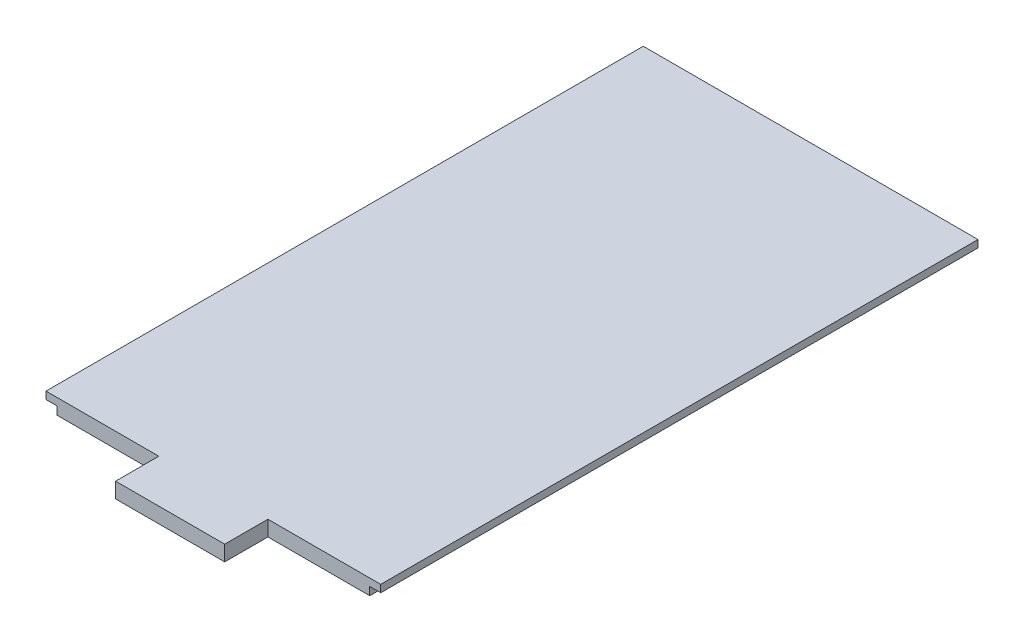
ISO-10303-21;
HEADER;
FILE_DESCRIPTION(('STEP AP214'),'2;1');
FILE_NAME('part.step','',(''),(''),'','','');
FILE_SCHEMA(('AUTOMOTIVE_DESIGN { 1 0 10303 214 1 1 1 1 }'));
ENDSEC;
DATA;
#1=APPLICATION_CONTEXT('core data for automotive mechanical design processes');
#2=APPLICATION_PROTOCOL_DEFINITION('international standard','automotive_design',2000,#1);
#3=PRODUCT_CONTEXT('',#1,'mechanical');
#4=PRODUCT('Part','Part','',(#3));
#5=PRODUCT_RELATED_PRODUCT_CATEGORY('part','',(#4));
#6=PRODUCT_DEFINITION_FORMATION('','',#4);
#7=PRODUCT_DEFINITION_CONTEXT('part definition',#1,'design');
#8=PRODUCT_DEFINITION('design','',#6,#7);
#9=PRODUCT_DEFINITION_SHAPE('','',#8);
#10=(LENGTH_UNIT() NAMED_UNIT(*) SI_UNIT(.MILLI.,.METRE.));
#11=(NAMED_UNIT(*) PLANE_ANGLE_UNIT() SI_UNIT($,.RADIAN.));
#12=(NAMED_UNIT(*) SI_UNIT($,.STERADIAN.) SOLID_ANGLE_UNIT());
#13=UNCERTAINTY_MEASURE_WITH_UNIT(LENGTH_MEASURE(1.E-05),#10,'distance_accuracy_value','');
#14=(GEOMETRIC_REPRESENTATION_CONTEXT(3) GLOBAL_UNCERTAINTY_ASSIGNED_CONTEXT((#13)) GLOBAL_UNIT_ASSIGNED_CONTEXT((#10,
#11,#12)) REPRESENTATION_CONTEXT('',''));
#15=CARTESIAN_POINT('',(0.,0.,0.));
#16=DIRECTION('',(0.,0.,1.));
#17=DIRECTION('',(1.,0.,0.));
#18=AXIS2_PLACEMENT_3D('',#15,#16,#17);
#19=CARTESIAN_POINT('',(0.,0.,163.1));
#20=DIRECTION('',(0.,0.,1.));
#21=DIRECTION('',(1.,0.,0.));
#22=AXIS2_PLACEMENT_3D('',#19,#20,#21);
#23=PLANE('',#22);
#24=DIRECTION('',(-1.,0.,0.));
#25=VECTOR('',#24,1.);
#26=CARTESIAN_POINT('',(-45.7,4.19999999999999,163.1));
#27=LINE('',#26,#25);
#28=CARTESIAN_POINT('',(45.7,4.19999999999999,163.1));
#29=VERTEX_POINT('',#28);
#30=CARTESIAN_POINT('',(14.9,4.2,163.1));
#31=VERTEX_POINT('',#30);
#32=EDGE_CURVE('E144',#29,#31,#27,.T.);
#33=ORIENTED_EDGE('',*,*,#32,.T.);
#34=DIRECTION('',(0.,-1.,0.));
#35=VECTOR('',#34,1.);
#36=CARTESIAN_POINT('',(14.9,4.2,163.1));
#37=LINE('',#36,#35);
#38=CARTESIAN_POINT('',(14.9,0.,163.1));
#39=VERTEX_POINT('',#38);
#40=EDGE_CURVE('E242',#31,#39,#37,.T.);
#41=ORIENTED_EDGE('',*,*,#40,.T.);
#42=DIRECTION('',(1.,0.,0.));
#43=VECTOR('',#42,1.);
#44=CARTESIAN_POINT('',(42.7,0.,163.1));
#45=LINE('',#44,#43);
#46=CARTESIAN_POINT('',(42.7,0.,163.1));
#47=VERTEX_POINT('',#46);
#48=EDGE_CURVE('E233',#39,#47,#45,.T.);
#49=ORIENTED_EDGE('',*,*,#48,.T.);
#50=DIRECTION('',(0.,1.,0.));
#51=VECTOR('',#50,1.);
#52=CARTESIAN_POINT('',(42.7,2.19999999999999,163.1));
#53=LINE('',#52,#51);
#54=CARTESIAN_POINT('',(42.7,2.19999999999999,163.1));
#55=VERTEX_POINT('',#54);
#56=EDGE_CURVE('E208',#47,#55,#53,.T.);
#57=ORIENTED_EDGE('',*,*,#56,.T.);
#58=DIRECTION('',(1.,0.,0.));
#59=VECTOR('',#58,1.);
#60=CARTESIAN_POINT('',(45.7,2.19999999999999,163.1));
#61=LINE('',#60,#59);
#62=CARTESIAN_POINT('',(45.7,2.19999999999999,163.1));
#63=VERTEX_POINT('',#62);
#64=EDGE_CURVE('E226',#55,#63,#61,.T.);
#65=ORIENTED_EDGE('',*,*,#64,.T.);
#66=DIRECTION('',(0.,1.,0.));
#67=VECTOR('',#66,1.);
#68=CARTESIAN_POINT('',(45.7,4.19999999999999,163.1));
#69=LINE('',#68,#67);
#70=EDGE_CURVE('E145',#63,#29,#69,.T.);
#71=ORIENTED_EDGE('',*,*,#70,.T.);
#72=EDGE_LOOP('',(#33,#41,#49,#57,#65,#71));
#73=FACE_BOUND('',#72,.T.);
#74=ADVANCED_FACE('F39',(#73),#23,.T.);
#75=CARTESIAN_POINT('',(-42.7,0.,163.1));
#76=DIRECTION('',(1.,0.,0.));
#77=DIRECTION('',(0.,0.,-1.));
#78=AXIS2_PLACEMENT_3D('',#75,#76,#77);
#79=PLANE('',#78);
#80=DIRECTION('',(0.,-1.,0.));
#81=VECTOR('',#80,1.);
#82=CARTESIAN_POINT('',(-42.7,0.,0.));
#83=LINE('',#82,#81);
#84=CARTESIAN_POINT('',(-42.7,2.19999999999999,0.));
#85=VERTEX_POINT('',#84);
#86=CARTESIAN_POINT('',(-42.7,0.,0.));
#87=VERTEX_POINT('',#86);
#88=EDGE_CURVE('E170',#85,#87,#83,.T.);
#89=ORIENTED_EDGE('',*,*,#88,.T.);
#90=DIRECTION('',(0.,0.,-1.));
#91=VECTOR('',#90,1.);
#92=CARTESIAN_POINT('',(-42.7,0.,163.1));
#93=LINE('',#92,#91);
#94=CARTESIAN_POINT('',(-42.7,0.,163.1));
#95=VERTEX_POINT('',#94);
#96=EDGE_CURVE('E11',#95,#87,#93,.T.);
#97=ORIENTED_EDGE('',*,*,#96,.F.);
#98=DIRECTION('',(0.,-1.,0.));
#99=VECTOR('',#98,1.);
#100=CARTESIAN_POINT('',(-42.7,0.,163.1));
#101=LINE('',#100,#99);
#102=CARTESIAN_POINT('',(-42.7,2.19999999999999,163.1));
#103=VERTEX_POINT('',#102);
#104=EDGE_CURVE('E186',#103,#95,#101,.T.);
#105=ORIENTED_EDGE('',*,*,#104,.F.);
#106=DIRECTION('',(0.,0.,-1.));
#107=VECTOR('',#106,1.);
#108=CARTESIAN_POINT('',(-42.7,2.19999999999999,163.1));
#109=LINE('',#108,#107);
#110=EDGE_CURVE('E164',#103,#85,#109,.T.);
#111=ORIENTED_EDGE('',*,*,#110,.T.);
#112=EDGE_LOOP('',(#89,#97,#105,#111));
#113=FACE_BOUND('',#112,.T.);
#114=ADVANCED_FACE('F41',(#113),#79,.F.);
#115=CARTESIAN_POINT('',(42.7,0.,163.1));
#116=DIRECTION('',(0.,1.,0.));
#117=DIRECTION('',(0.,0.,1.));
#118=AXIS2_PLACEMENT_3D('',#115,#116,#117);
#119=PLANE('',#118);
#120=DIRECTION('',(1.,0.,0.));
#121=VECTOR('',#120,1.);
#122=CARTESIAN_POINT('',(42.7,0.,0.));
#123=LINE('',#122,#121);
#124=CARTESIAN_POINT('',(42.7,0.,0.));
#125=VERTEX_POINT('',#124);
#126=EDGE_CURVE('E173',#87,#125,#123,.T.);
#127=ORIENTED_EDGE('',*,*,#126,.T.);
#128=DIRECTION('',(0.,0.,-1.));
#129=VECTOR('',#128,1.);
#130=CARTESIAN_POINT('',(42.7,0.,163.1));
#131=LINE('',#130,#129);
#132=EDGE_CURVE('E48',#47,#125,#131,.T.);
#133=ORIENTED_EDGE('',*,*,#132,.F.);
#134=ORIENTED_EDGE('',*,*,#48,.F.);
#135=DIRECTION('',(0.,0.,1.));
#136=VECTOR('',#135,1.);
#137=CARTESIAN_POINT('',(14.9,0.,163.1));
#138=LINE('',#137,#136);
#139=CARTESIAN_POINT('',(14.9,0.,174.9));
#140=VERTEX_POINT('',#139);
#141=EDGE_CURVE('E57',#39,#140,#138,.T.);
#142=ORIENTED_EDGE('',*,*,#141,.T.);
#143=DIRECTION('',(1.,0.,0.));
#144=VECTOR('',#143,1.);
#145=CARTESIAN_POINT('',(-14.9,0.,174.9));
#146=LINE('',#145,#144);
#147=CARTESIAN_POINT('',(-14.9,0.,174.9));
#148=VERTEX_POINT('',#147);
#149=EDGE_CURVE('E251',#148,#140,#146,.T.);
#150=ORIENTED_EDGE('',*,*,#149,.F.);
#151=DIRECTION('',(0.,0.,1.));
#152=VECTOR('',#151,1.);
#153=CARTESIAN_POINT('',(-14.9,0.,163.1));
#154=LINE('',#153,#152);
#155=CARTESIAN_POINT('',(-14.9,0.,163.1));
#156=VERTEX_POINT('',#155);
#157=EDGE_CURVE('E255',#156,#148,#154,.T.);
#158=ORIENTED_EDGE('',*,*,#157,.F.);
#159=EDGE_CURVE('E111',#95,#156,#45,.T.);
#160=ORIENTED_EDGE('',*,*,#159,.F.);
#161=ORIENTED_EDGE('',*,*,#96,.T.);
#162=EDGE_LOOP('',(#127,#133,#134,#142,#150,#158,#160,#161));
#163=FACE_BOUND('',#162,.T.);
#164=ADVANCED_FACE('F299',(#163),#119,.F.);
#165=CARTESIAN_POINT('',(42.7,2.19999999999999,163.1));
#166=DIRECTION('',(-1.,0.,0.));
#167=DIRECTION('',(0.,0.,1.));
#168=AXIS2_PLACEMENT_3D('',#165,#166,#167);
#169=PLANE('',#168);
#170=DIRECTION('',(0.,1.,0.));
#171=VECTOR('',#170,1.);
#172=CARTESIAN_POINT('',(42.7,2.19999999999999,0.));
#173=LINE('',#172,#171);
#174=CARTESIAN_POINT('',(42.7,2.19999999999999,0.));
#175=VERTEX_POINT('',#174);
#176=EDGE_CURVE('E176',#125,#175,#173,.T.);
#177=ORIENTED_EDGE('',*,*,#176,.T.);
#178=DIRECTION('',(0.,0.,-1.));
#179=VECTOR('',#178,1.);
#180=CARTESIAN_POINT('',(42.7,2.19999999999999,163.1));
#181=LINE('',#180,#179);
#182=EDGE_CURVE('E196',#55,#175,#181,.T.);
#183=ORIENTED_EDGE('',*,*,#182,.F.);
#184=ORIENTED_EDGE('',*,*,#56,.F.);
#185=ORIENTED_EDGE('',*,*,#132,.T.);
#186=EDGE_LOOP('',(#177,#183,#184,#185));
#187=FACE_BOUND('',#186,.T.);
#188=ADVANCED_FACE('F206',(#187),#169,.F.);
#189=CARTESIAN_POINT('',(45.7,2.19999999999999,163.1));
#190=DIRECTION('',(0.,1.,0.));
#191=DIRECTION('',(-1.,0.,0.));
#192=AXIS2_PLACEMENT_3D('',#189,#190,#191);
#193=PLANE('',#192);
#194=DIRECTION('',(1.,0.,0.));
#195=VECTOR('',#194,1.);
#196=CARTESIAN_POINT('',(45.7,2.19999999999999,0.));
#197=LINE('',#196,#195);
#198=CARTESIAN_POINT('',(45.7,2.19999999999999,0.));
#199=VERTEX_POINT('',#198);
#200=EDGE_CURVE('E178',#175,#199,#197,.T.);
#201=ORIENTED_EDGE('',*,*,#200,.T.);
#202=DIRECTION('',(0.,0.,-1.));
#203=VECTOR('',#202,1.);
#204=CARTESIAN_POINT('',(45.7,2.19999999999999,163.1));
#205=LINE('',#204,#203);
#206=EDGE_CURVE('E192',#63,#199,#205,.T.);
#207=ORIENTED_EDGE('',*,*,#206,.F.);
#208=ORIENTED_EDGE('',*,*,#64,.F.);
#209=ORIENTED_EDGE('',*,*,#182,.T.);
#210=EDGE_LOOP('',(#201,#207,#208,#209));
#211=FACE_BOUND('',#210,.T.);
#212=ADVANCED_FACE('F217',(#211),#193,.F.);
#213=CARTESIAN_POINT('',(45.7,4.19999999999999,163.1));
#214=DIRECTION('',(-1.,0.,0.));
#215=DIRECTION('',(0.,0.,1.));
#216=AXIS2_PLACEMENT_3D('',#213,#214,#215);
#217=PLANE('',#216);
#218=DIRECTION('',(0.,1.,0.));
#219=VECTOR('',#218,1.);
#220=CARTESIAN_POINT('',(45.7,4.19999999999999,0.));
#221=LINE('',#220,#219);
#222=CARTESIAN_POINT('',(45.7,4.19999999999999,0.));
#223=VERTEX_POINT('',#222);
#224=EDGE_CURVE('E180',#199,#223,#221,.T.);
#225=ORIENTED_EDGE('',*,*,#224,.T.);
#226=DIRECTION('',(0.,0.,-1.));
#227=VECTOR('',#226,1.);
#228=CARTESIAN_POINT('',(45.7,4.19999999999999,163.1));
#229=LINE('',#228,#227);
#230=EDGE_CURVE('E156',#29,#223,#229,.T.);
#231=ORIENTED_EDGE('',*,*,#230,.F.);
#232=ORIENTED_EDGE('',*,*,#70,.F.);
#233=ORIENTED_EDGE('',*,*,#206,.T.);
#234=EDGE_LOOP('',(#225,#231,#232,#233));
#235=FACE_BOUND('',#234,.T.);
#236=ADVANCED_FACE('F221',(#235),#217,.F.);
#237=CARTESIAN_POINT('',(-45.7,4.19999999999999,163.1));
#238=DIRECTION('',(0.,-1.,0.));
#239=DIRECTION('',(0.,0.,-1.));
#240=AXIS2_PLACEMENT_3D('',#237,#238,#239);
#241=PLANE('',#240);
#242=DIRECTION('',(-1.,0.,0.));
#243=VECTOR('',#242,1.);
#244=CARTESIAN_POINT('',(-45.7,4.19999999999999,0.));
#245=LINE('',#244,#243);
#246=CARTESIAN_POINT('',(-45.7,4.19999999999999,0.));
#247=VERTEX_POINT('',#246);
#248=EDGE_CURVE('E152',#223,#247,#245,.T.);
#249=ORIENTED_EDGE('',*,*,#248,.T.);
#250=DIRECTION('',(0.,0.,-1.));
#251=VECTOR('',#250,1.);
#252=CARTESIAN_POINT('',(-45.7,4.19999999999999,163.1));
#253=LINE('',#252,#251);
#254=CARTESIAN_POINT('',(-45.7,4.19999999999999,163.1));
#255=VERTEX_POINT('',#254);
#256=EDGE_CURVE('E148',#255,#247,#253,.T.);
#257=ORIENTED_EDGE('',*,*,#256,.F.);
#258=CARTESIAN_POINT('',(-14.9,4.2,163.1));
#259=VERTEX_POINT('',#258);
#260=EDGE_CURVE('E133',#259,#255,#27,.T.);
#261=ORIENTED_EDGE('',*,*,#260,.F.);
#262=DIRECTION('',(0.,0.,1.));
#263=VECTOR('',#262,1.);
#264=CARTESIAN_POINT('',(-14.9,4.2,163.1));
#265=LINE('',#264,#263);
#266=CARTESIAN_POINT('',(-14.9,4.2,174.9));
#267=VERTEX_POINT('',#266);
#268=EDGE_CURVE('E250',#259,#267,#265,.T.);
#269=ORIENTED_EDGE('',*,*,#268,.T.);
#270=DIRECTION('',(1.,0.,0.));
#271=VECTOR('',#270,1.);
#272=CARTESIAN_POINT('',(-14.9,4.2,174.9));
#273=LINE('',#272,#271);
#274=CARTESIAN_POINT('',(14.9,4.2,174.9));
#275=VERTEX_POINT('',#274);
#276=EDGE_CURVE('E262',#267,#275,#273,.T.);
#277=ORIENTED_EDGE('',*,*,#276,.T.);
#278=DIRECTION('',(0.,0.,1.));
#279=VECTOR('',#278,1.);
#280=CARTESIAN_POINT('',(14.9,4.2,163.1));
#281=LINE('',#280,#279);
#282=EDGE_CURVE('E247',#31,#275,#281,.T.);
#283=ORIENTED_EDGE('',*,*,#282,.F.);
#284=ORIENTED_EDGE('',*,*,#32,.F.);
#285=ORIENTED_EDGE('',*,*,#230,.T.);
#286=EDGE_LOOP('',(#249,#257,#261,#269,#277,#283,#284,#285));
#287=FACE_BOUND('',#286,.T.);
#288=ADVANCED_FACE('F149',(#287),#241,.F.);
#289=CARTESIAN_POINT('',(-45.7,2.19999999999999,163.1));
#290=DIRECTION('',(1.,0.,0.));
#291=DIRECTION('',(0.,0.,-1.));
#292=AXIS2_PLACEMENT_3D('',#289,#290,#291);
#293=PLANE('',#292);
#294=DIRECTION('',(0.,-1.,0.));
#295=VECTOR('',#294,1.);
#296=CARTESIAN_POINT('',(-45.7,2.19999999999999,0.));
#297=LINE('',#296,#295);
#298=CARTESIAN_POINT('',(-45.7,2.19999999999999,0.));
#299=VERTEX_POINT('',#298);
#300=EDGE_CURVE('E183',#247,#299,#297,.T.);
#301=ORIENTED_EDGE('',*,*,#300,.T.);
#302=DIRECTION('',(0.,0.,-1.));
#303=VECTOR('',#302,1.);
#304=CARTESIAN_POINT('',(-45.7,2.19999999999999,163.1));
#305=LINE('',#304,#303);
#306=CARTESIAN_POINT('',(-45.7,2.19999999999999,163.1));
#307=VERTEX_POINT('',#306);
#308=EDGE_CURVE('E157',#307,#299,#305,.T.);
#309=ORIENTED_EDGE('',*,*,#308,.F.);
#310=DIRECTION('',(0.,-1.,0.));
#311=VECTOR('',#310,1.);
#312=CARTESIAN_POINT('',(-45.7,2.19999999999999,163.1));
#313=LINE('',#312,#311);
#314=EDGE_CURVE('E137',#255,#307,#313,.T.);
#315=ORIENTED_EDGE('',*,*,#314,.F.);
#316=ORIENTED_EDGE('',*,*,#256,.T.);
#317=EDGE_LOOP('',(#301,#309,#315,#316));
#318=FACE_BOUND('',#317,.T.);
#319=ADVANCED_FACE('F159',(#318),#293,.F.);
#320=CARTESIAN_POINT('',(-42.7,2.19999999999999,163.1));
#321=DIRECTION('',(0.,1.,0.));
#322=DIRECTION('',(-1.,0.,0.));
#323=AXIS2_PLACEMENT_3D('',#320,#321,#322);
#324=PLANE('',#323);
#325=DIRECTION('',(1.,0.,0.));
#326=VECTOR('',#325,1.);
#327=CARTESIAN_POINT('',(-42.7,2.19999999999999,0.));
#328=LINE('',#327,#326);
#329=EDGE_CURVE('E102',#299,#85,#328,.T.);
#330=ORIENTED_EDGE('',*,*,#329,.T.);
#331=ORIENTED_EDGE('',*,*,#110,.F.);
#332=DIRECTION('',(1.,0.,0.));
#333=VECTOR('',#332,1.);
#334=CARTESIAN_POINT('',(-42.7,2.19999999999999,163.1));
#335=LINE('',#334,#333);
#336=EDGE_CURVE('E68',#307,#103,#335,.T.);
#337=ORIENTED_EDGE('',*,*,#336,.F.);
#338=ORIENTED_EDGE('',*,*,#308,.T.);
#339=EDGE_LOOP('',(#330,#331,#337,#338));
#340=FACE_BOUND('',#339,.T.);
#341=ADVANCED_FACE('F304',(#340),#324,.F.);
#342=DIRECTION('',(0.,-1.,0.));
#343=VECTOR('',#342,1.);
#344=CARTESIAN_POINT('',(-14.9,4.2,163.1));
#345=LINE('',#344,#343);
#346=EDGE_CURVE('E140',#259,#156,#345,.T.);
#347=ORIENTED_EDGE('',*,*,#346,.F.);
#348=ORIENTED_EDGE('',*,*,#260,.T.);
#349=ORIENTED_EDGE('',*,*,#314,.T.);
#350=ORIENTED_EDGE('',*,*,#336,.T.);
#351=ORIENTED_EDGE('',*,*,#104,.T.);
#352=ORIENTED_EDGE('',*,*,#159,.T.);
#353=EDGE_LOOP('',(#347,#348,#349,#350,#351,#352));
#354=FACE_BOUND('',#353,.T.);
#355=ADVANCED_FACE('F135',(#354),#23,.T.);
#356=CARTESIAN_POINT('',(0.,0.,0.));
#357=DIRECTION('',(0.,0.,1.));
#358=DIRECTION('',(1.,0.,0.));
#359=AXIS2_PLACEMENT_3D('',#356,#357,#358);
#360=PLANE('',#359);
#361=ORIENTED_EDGE('',*,*,#88,.F.);
#362=ORIENTED_EDGE('',*,*,#329,.F.);
#363=ORIENTED_EDGE('',*,*,#300,.F.);
#364=ORIENTED_EDGE('',*,*,#248,.F.);
#365=ORIENTED_EDGE('',*,*,#224,.F.);
#366=ORIENTED_EDGE('',*,*,#200,.F.);
#367=ORIENTED_EDGE('',*,*,#176,.F.);
#368=ORIENTED_EDGE('',*,*,#126,.F.);
#369=EDGE_LOOP('',(#361,#362,#363,#364,#365,#366,#367,#368));
#370=FACE_BOUND('',#369,.T.);
#371=ADVANCED_FACE('F213',(#370),#360,.F.);
#372=CARTESIAN_POINT('',(-14.9,4.2,163.1));
#373=DIRECTION('',(1.,0.,0.));
#374=DIRECTION('',(0.,0.,-1.));
#375=AXIS2_PLACEMENT_3D('',#372,#373,#374);
#376=PLANE('',#375);
#377=ORIENTED_EDGE('',*,*,#157,.T.);
#378=DIRECTION('',(0.,-1.,0.));
#379=VECTOR('',#378,1.);
#380=CARTESIAN_POINT('',(-14.9,4.2,174.9));
#381=LINE('',#380,#379);
#382=EDGE_CURVE('E174',#267,#148,#381,.T.);
#383=ORIENTED_EDGE('',*,*,#382,.F.);
#384=ORIENTED_EDGE('',*,*,#268,.F.);
#385=ORIENTED_EDGE('',*,*,#346,.T.);
#386=EDGE_LOOP('',(#377,#383,#384,#385));
#387=FACE_BOUND('',#386,.T.);
#388=ADVANCED_FACE('F277',(#387),#376,.F.);
#389=CARTESIAN_POINT('',(-14.9,4.2,174.9));
#390=DIRECTION('',(0.,0.,-1.));
#391=DIRECTION('',(-1.,0.,0.));
#392=AXIS2_PLACEMENT_3D('',#389,#390,#391);
#393=PLANE('',#392);
#394=ORIENTED_EDGE('',*,*,#149,.T.);
#395=DIRECTION('',(0.,-1.,0.));
#396=VECTOR('',#395,1.);
#397=CARTESIAN_POINT('',(14.9,4.2,174.9));
#398=LINE('',#397,#396);
#399=EDGE_CURVE('E239',#275,#140,#398,.T.);
#400=ORIENTED_EDGE('',*,*,#399,.F.);
#401=ORIENTED_EDGE('',*,*,#276,.F.);
#402=ORIENTED_EDGE('',*,*,#382,.T.);
#403=EDGE_LOOP('',(#394,#400,#401,#402));
#404=FACE_BOUND('',#403,.T.);
#405=ADVANCED_FACE('F280',(#404),#393,.F.);
#406=CARTESIAN_POINT('',(14.9,4.2,163.1));
#407=DIRECTION('',(1.,0.,0.));
#408=DIRECTION('',(0.,0.,-1.));
#409=AXIS2_PLACEMENT_3D('',#406,#407,#408);
#410=PLANE('',#409);
#411=ORIENTED_EDGE('',*,*,#141,.F.);
#412=ORIENTED_EDGE('',*,*,#40,.F.);
#413=ORIENTED_EDGE('',*,*,#282,.T.);
#414=ORIENTED_EDGE('',*,*,#399,.T.);
#415=EDGE_LOOP('',(#411,#412,#413,#414));
#416=FACE_BOUND('',#415,.T.);
#417=ADVANCED_FACE('F292',(#416),#410,.T.);
#418=CLOSED_SHELL('',(#74,#114,#164,#188,#212,#236,#288,#319,#341,#355,#371,#388,#405,#417));
#419=MANIFOLD_SOLID_BREP('B2',#418);
#420=ADVANCED_BREP_SHAPE_REPRESENTATION('',(#18,#419),#14);
#421=SHAPE_DEFINITION_REPRESENTATION(#9,#420);
ENDSEC;
END-ISO-10303-21;
